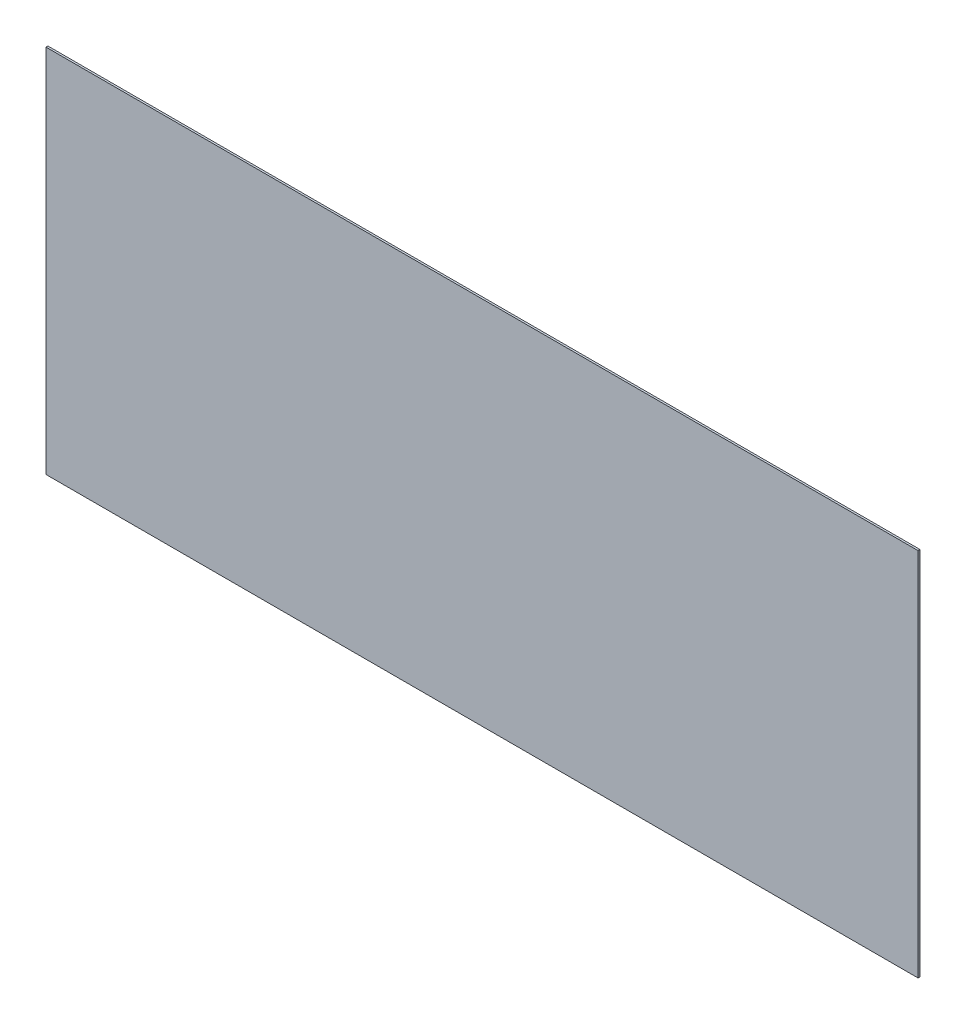
ISO-10303-21;
HEADER;
FILE_DESCRIPTION(('STEP AP214'),'2;1');
FILE_NAME('part.step','',(''),(''),'','','');
FILE_SCHEMA(('AUTOMOTIVE_DESIGN { 1 0 10303 214 1 1 1 1 }'));
ENDSEC;
DATA;
#1=APPLICATION_CONTEXT('core data for automotive mechanical design processes');
#2=APPLICATION_PROTOCOL_DEFINITION('international standard','automotive_design',2000,#1);
#3=PRODUCT_CONTEXT('',#1,'mechanical');
#4=PRODUCT('Part','Part','',(#3));
#5=PRODUCT_RELATED_PRODUCT_CATEGORY('part','',(#4));
#6=PRODUCT_DEFINITION_FORMATION('','',#4);
#7=PRODUCT_DEFINITION_CONTEXT('part definition',#1,'design');
#8=PRODUCT_DEFINITION('design','',#6,#7);
#9=PRODUCT_DEFINITION_SHAPE('','',#8);
#10=(LENGTH_UNIT() NAMED_UNIT(*) SI_UNIT(.MILLI.,.METRE.));
#11=(NAMED_UNIT(*) PLANE_ANGLE_UNIT() SI_UNIT($,.RADIAN.));
#12=(NAMED_UNIT(*) SI_UNIT($,.STERADIAN.) SOLID_ANGLE_UNIT());
#13=UNCERTAINTY_MEASURE_WITH_UNIT(LENGTH_MEASURE(1.E-05),#10,'distance_accuracy_value','');
#14=(GEOMETRIC_REPRESENTATION_CONTEXT(3) GLOBAL_UNCERTAINTY_ASSIGNED_CONTEXT((#13)) GLOBAL_UNIT_ASSIGNED_CONTEXT((#10,
#11,#12)) REPRESENTATION_CONTEXT('',''));
#15=CARTESIAN_POINT('',(0.,0.,0.));
#16=DIRECTION('',(0.,0.,1.));
#17=DIRECTION('',(1.,0.,0.));
#18=AXIS2_PLACEMENT_3D('',#15,#16,#17);
#19=CARTESIAN_POINT('',(225.,95.5,1.));
#20=DIRECTION('',(-1.,0.,0.));
#21=DIRECTION('',(0.,-1.,0.));
#22=AXIS2_PLACEMENT_3D('',#19,#20,#21);
#23=PLANE('',#22);
#24=DIRECTION('',(0.,1.,0.));
#25=VECTOR('',#24,1.);
#26=CARTESIAN_POINT('',(225.,95.5,0.));
#27=LINE('',#26,#25);
#28=CARTESIAN_POINT('',(225.,-95.5,0.));
#29=VERTEX_POINT('',#28);
#30=CARTESIAN_POINT('',(225.,95.5,0.));
#31=VERTEX_POINT('',#30);
#32=EDGE_CURVE('E113',#29,#31,#27,.T.);
#33=ORIENTED_EDGE('',*,*,#32,.T.);
#34=DIRECTION('',(0.,0.,-1.));
#35=VECTOR('',#34,1.);
#36=CARTESIAN_POINT('',(225.,95.5,1.));
#37=LINE('',#36,#35);
#38=CARTESIAN_POINT('',(225.,95.5,1.));
#39=VERTEX_POINT('',#38);
#40=EDGE_CURVE('E11',#39,#31,#37,.T.);
#41=ORIENTED_EDGE('',*,*,#40,.F.);
#42=DIRECTION('',(0.,1.,0.));
#43=VECTOR('',#42,1.);
#44=CARTESIAN_POINT('',(225.,95.5,1.));
#45=LINE('',#44,#43);
#46=CARTESIAN_POINT('',(225.,-95.5,1.));
#47=VERTEX_POINT('',#46);
#48=EDGE_CURVE('E97',#47,#39,#45,.T.);
#49=ORIENTED_EDGE('',*,*,#48,.F.);
#50=DIRECTION('',(0.,0.,-1.));
#51=VECTOR('',#50,1.);
#52=CARTESIAN_POINT('',(225.,-95.5,1.));
#53=LINE('',#52,#51);
#54=EDGE_CURVE('E109',#47,#29,#53,.T.);
#55=ORIENTED_EDGE('',*,*,#54,.T.);
#56=EDGE_LOOP('',(#33,#41,#49,#55));
#57=FACE_BOUND('',#56,.T.);
#58=ADVANCED_FACE('F45',(#57),#23,.F.);
#59=CARTESIAN_POINT('',(-225.,95.5,1.));
#60=DIRECTION('',(0.,-1.,0.));
#61=DIRECTION('',(0.,0.,-1.));
#62=AXIS2_PLACEMENT_3D('',#59,#60,#61);
#63=PLANE('',#62);
#64=DIRECTION('',(-1.,0.,0.));
#65=VECTOR('',#64,1.);
#66=CARTESIAN_POINT('',(-225.,95.5,0.));
#67=LINE('',#66,#65);
#68=CARTESIAN_POINT('',(-225.,95.5,0.));
#69=VERTEX_POINT('',#68);
#70=EDGE_CURVE('E102',#31,#69,#67,.T.);
#71=ORIENTED_EDGE('',*,*,#70,.T.);
#72=DIRECTION('',(0.,0.,-1.));
#73=VECTOR('',#72,1.);
#74=CARTESIAN_POINT('',(-225.,95.5,1.));
#75=LINE('',#74,#73);
#76=CARTESIAN_POINT('',(-225.,95.5,1.));
#77=VERTEX_POINT('',#76);
#78=EDGE_CURVE('E54',#77,#69,#75,.T.);
#79=ORIENTED_EDGE('',*,*,#78,.F.);
#80=DIRECTION('',(-1.,0.,0.));
#81=VECTOR('',#80,1.);
#82=CARTESIAN_POINT('',(-225.,95.5,1.));
#83=LINE('',#82,#81);
#84=EDGE_CURVE('E92',#39,#77,#83,.T.);
#85=ORIENTED_EDGE('',*,*,#84,.F.);
#86=ORIENTED_EDGE('',*,*,#40,.T.);
#87=EDGE_LOOP('',(#71,#79,#85,#86));
#88=FACE_BOUND('',#87,.T.);
#89=ADVANCED_FACE('F101',(#88),#63,.F.);
#90=CARTESIAN_POINT('',(-225.,95.5,1.));
#91=DIRECTION('',(1.,0.,0.));
#92=DIRECTION('',(0.,0.,-1.));
#93=AXIS2_PLACEMENT_3D('',#90,#91,#92);
#94=PLANE('',#93);
#95=DIRECTION('',(0.,-1.,0.));
#96=VECTOR('',#95,1.);
#97=CARTESIAN_POINT('',(-225.,95.5,0.));
#98=LINE('',#97,#96);
#99=CARTESIAN_POINT('',(-225.,-95.5,0.));
#100=VERTEX_POINT('',#99);
#101=EDGE_CURVE('E79',#69,#100,#98,.T.);
#102=ORIENTED_EDGE('',*,*,#101,.T.);
#103=DIRECTION('',(0.,0.,-1.));
#104=VECTOR('',#103,1.);
#105=CARTESIAN_POINT('',(-225.,-95.5,1.));
#106=LINE('',#105,#104);
#107=CARTESIAN_POINT('',(-225.,-95.5,1.));
#108=VERTEX_POINT('',#107);
#109=EDGE_CURVE('E104',#108,#100,#106,.T.);
#110=ORIENTED_EDGE('',*,*,#109,.F.);
#111=DIRECTION('',(0.,-1.,0.));
#112=VECTOR('',#111,1.);
#113=CARTESIAN_POINT('',(-225.,95.5,1.));
#114=LINE('',#113,#112);
#115=EDGE_CURVE('E95',#77,#108,#114,.T.);
#116=ORIENTED_EDGE('',*,*,#115,.F.);
#117=ORIENTED_EDGE('',*,*,#78,.T.);
#118=EDGE_LOOP('',(#102,#110,#116,#117));
#119=FACE_BOUND('',#118,.T.);
#120=ADVANCED_FACE('F105',(#119),#94,.F.);
#121=CARTESIAN_POINT('',(-225.,-95.5,1.));
#122=DIRECTION('',(0.,1.,0.));
#123=DIRECTION('',(0.,0.,1.));
#124=AXIS2_PLACEMENT_3D('',#121,#122,#123);
#125=PLANE('',#124);
#126=DIRECTION('',(1.,0.,0.));
#127=VECTOR('',#126,1.);
#128=CARTESIAN_POINT('',(-225.,-95.5,0.));
#129=LINE('',#128,#127);
#130=EDGE_CURVE('E85',#100,#29,#129,.T.);
#131=ORIENTED_EDGE('',*,*,#130,.T.);
#132=ORIENTED_EDGE('',*,*,#54,.F.);
#133=DIRECTION('',(1.,0.,0.));
#134=VECTOR('',#133,1.);
#135=CARTESIAN_POINT('',(-225.,-95.5,1.));
#136=LINE('',#135,#134);
#137=EDGE_CURVE('E62',#108,#47,#136,.T.);
#138=ORIENTED_EDGE('',*,*,#137,.F.);
#139=ORIENTED_EDGE('',*,*,#109,.T.);
#140=EDGE_LOOP('',(#131,#132,#138,#139));
#141=FACE_BOUND('',#140,.T.);
#142=ADVANCED_FACE('F126',(#141),#125,.F.);
#143=CARTESIAN_POINT('',(0.,0.,1.));
#144=DIRECTION('',(0.,0.,1.));
#145=DIRECTION('',(1.,0.,0.));
#146=AXIS2_PLACEMENT_3D('',#143,#144,#145);
#147=PLANE('',#146);
#148=ORIENTED_EDGE('',*,*,#48,.T.);
#149=ORIENTED_EDGE('',*,*,#84,.T.);
#150=ORIENTED_EDGE('',*,*,#115,.T.);
#151=ORIENTED_EDGE('',*,*,#137,.T.);
#152=EDGE_LOOP('',(#148,#149,#150,#151));
#153=FACE_BOUND('',#152,.T.);
#154=ADVANCED_FACE('F93',(#153),#147,.T.);
#155=CARTESIAN_POINT('',(0.,0.,0.));
#156=DIRECTION('',(0.,0.,1.));
#157=DIRECTION('',(1.,0.,0.));
#158=AXIS2_PLACEMENT_3D('',#155,#156,#157);
#159=PLANE('',#158);
#160=ORIENTED_EDGE('',*,*,#32,.F.);
#161=ORIENTED_EDGE('',*,*,#130,.F.);
#162=ORIENTED_EDGE('',*,*,#101,.F.);
#163=ORIENTED_EDGE('',*,*,#70,.F.);
#164=EDGE_LOOP('',(#160,#161,#162,#163));
#165=FACE_BOUND('',#164,.T.);
#166=ADVANCED_FACE('F129',(#165),#159,.F.);
#167=CLOSED_SHELL('',(#58,#89,#120,#142,#154,#166));
#168=MANIFOLD_SOLID_BREP('B2',#167);
#169=ADVANCED_BREP_SHAPE_REPRESENTATION('',(#18,#168),#14);
#170=SHAPE_DEFINITION_REPRESENTATION(#9,#169);
ENDSEC;
END-ISO-10303-21;
